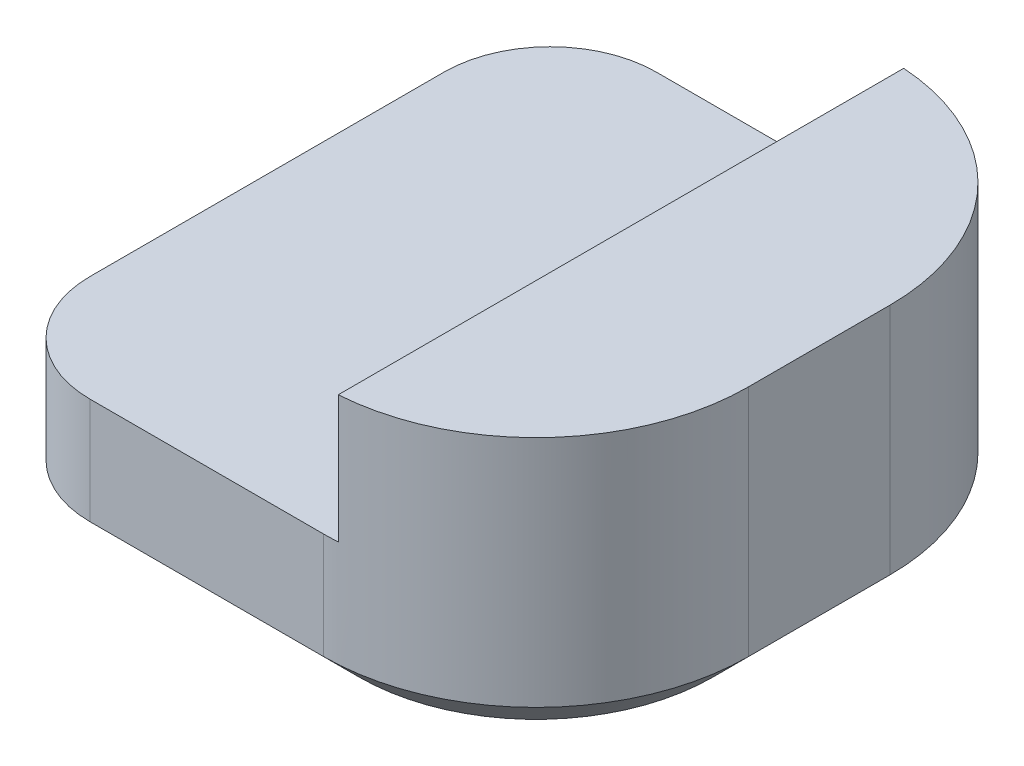
ISO-10303-21;
HEADER;
FILE_DESCRIPTION(('STEP AP214'),'2;1');
FILE_NAME('part.step','',(''),(''),'','','');
FILE_SCHEMA(('AUTOMOTIVE_DESIGN { 1 0 10303 214 1 1 1 1 }'));
ENDSEC;
DATA;
#1=APPLICATION_CONTEXT('core data for automotive mechanical design processes');
#2=APPLICATION_PROTOCOL_DEFINITION('international standard','automotive_design',2000,#1);
#3=PRODUCT_CONTEXT('',#1,'mechanical');
#4=PRODUCT('Part','Part','',(#3));
#5=PRODUCT_RELATED_PRODUCT_CATEGORY('part','',(#4));
#6=PRODUCT_DEFINITION_FORMATION('','',#4);
#7=PRODUCT_DEFINITION_CONTEXT('part definition',#1,'design');
#8=PRODUCT_DEFINITION('design','',#6,#7);
#9=PRODUCT_DEFINITION_SHAPE('','',#8);
#10=(LENGTH_UNIT() NAMED_UNIT(*) SI_UNIT(.MILLI.,.METRE.));
#11=(NAMED_UNIT(*) PLANE_ANGLE_UNIT() SI_UNIT($,.RADIAN.));
#12=(NAMED_UNIT(*) SI_UNIT($,.STERADIAN.) SOLID_ANGLE_UNIT());
#13=UNCERTAINTY_MEASURE_WITH_UNIT(LENGTH_MEASURE(1.E-05),#10,'distance_accuracy_value','');
#14=(GEOMETRIC_REPRESENTATION_CONTEXT(3) GLOBAL_UNCERTAINTY_ASSIGNED_CONTEXT((#13)) GLOBAL_UNIT_ASSIGNED_CONTEXT((#10,
#11,#12)) REPRESENTATION_CONTEXT('',''));
#15=CARTESIAN_POINT('',(0.,0.,0.));
#16=DIRECTION('',(0.,0.,1.));
#17=DIRECTION('',(1.,0.,0.));
#18=AXIS2_PLACEMENT_3D('',#15,#16,#17);
#19=CARTESIAN_POINT('',(0.,-2.,8.));
#20=DIRECTION('',(1.,0.,0.));
#21=DIRECTION('',(0.,0.,-1.));
#22=AXIS2_PLACEMENT_3D('',#19,#20,#21);
#23=PLANE('',#22);
#24=DIRECTION('',(0.,-1.,0.));
#25=VECTOR('',#24,1.);
#26=CARTESIAN_POINT('',(0.,-2.,1.5));
#27=LINE('',#26,#25);
#28=CARTESIAN_POINT('',(0.,0.,1.5));
#29=VERTEX_POINT('',#28);
#30=CARTESIAN_POINT('',(0.,-1.5,1.5));
#31=VERTEX_POINT('',#30);
#32=EDGE_CURVE('E200',#29,#31,#27,.T.);
#33=ORIENTED_EDGE('',*,*,#32,.T.);
#34=DIRECTION('',(0.,0.,1.));
#35=VECTOR('',#34,1.);
#36=CARTESIAN_POINT('',(0.,-1.5,8.));
#37=LINE('',#36,#35);
#38=CARTESIAN_POINT('',(0.,-1.5,6.5));
#39=VERTEX_POINT('',#38);
#40=EDGE_CURVE('E251',#31,#39,#37,.T.);
#41=ORIENTED_EDGE('',*,*,#40,.T.);
#42=DIRECTION('',(0.,-1.,0.));
#43=VECTOR('',#42,1.);
#44=CARTESIAN_POINT('',(0.,-2.,6.5));
#45=LINE('',#44,#43);
#46=CARTESIAN_POINT('',(0.,0.,6.5));
#47=VERTEX_POINT('',#46);
#48=EDGE_CURVE('E197',#39,#47,#45,.F.);
#49=ORIENTED_EDGE('',*,*,#48,.T.);
#50=DIRECTION('',(0.,0.,-1.));
#51=VECTOR('',#50,1.);
#52=CARTESIAN_POINT('',(0.,0.,8.));
#53=LINE('',#52,#51);
#54=EDGE_CURVE('E305',#47,#29,#53,.T.);
#55=ORIENTED_EDGE('',*,*,#54,.T.);
#56=EDGE_LOOP('',(#33,#41,#49,#55));
#57=FACE_BOUND('',#56,.T.);
#58=ADVANCED_FACE('F41',(#57),#23,.F.);
#59=CARTESIAN_POINT('',(6.43037974683545,-2.,8.));
#60=DIRECTION('',(0.,1.,0.));
#61=DIRECTION('',(-1.,0.,0.));
#62=AXIS2_PLACEMENT_3D('',#59,#60,#61);
#63=PLANE('',#62);
#64=CARTESIAN_POINT('',(4.8,-2.,5.));
#65=DIRECTION('',(0.,1.,0.));
#66=DIRECTION('',(-1.,0.,0.));
#67=AXIS2_PLACEMENT_3D('',#64,#65,#66);
#68=CIRCLE('',#67,2.5);
#69=CARTESIAN_POINT('',(7.3,-2.,5.));
#70=VERTEX_POINT('',#69);
#71=CARTESIAN_POINT('',(4.8,-2.,7.5));
#72=VERTEX_POINT('',#71);
#73=EDGE_CURVE('E236',#70,#72,#68,.F.);
#74=ORIENTED_EDGE('',*,*,#73,.T.);
#75=DIRECTION('',(-1.,0.,0.));
#76=VECTOR('',#75,1.);
#77=CARTESIAN_POINT('',(6.43037974683545,-2.,7.5));
#78=LINE('',#77,#76);
#79=CARTESIAN_POINT('',(1.5,-2.,7.5));
#80=VERTEX_POINT('',#79);
#81=EDGE_CURVE('E242',#72,#80,#78,.T.);
#82=ORIENTED_EDGE('',*,*,#81,.T.);
#83=CARTESIAN_POINT('',(1.5,-2.,6.5));
#84=DIRECTION('',(0.,1.,0.));
#85=DIRECTION('',(-1.,0.,0.));
#86=AXIS2_PLACEMENT_3D('',#83,#84,#85);
#87=CIRCLE('',#86,1.);
#88=CARTESIAN_POINT('',(0.499999999999999,-2.,6.5));
#89=VERTEX_POINT('',#88);
#90=EDGE_CURVE('E239',#80,#89,#87,.F.);
#91=ORIENTED_EDGE('',*,*,#90,.T.);
#92=DIRECTION('',(0.,0.,-1.));
#93=VECTOR('',#92,1.);
#94=CARTESIAN_POINT('',(0.499999999999999,-2.,8.));
#95=LINE('',#94,#93);
#96=CARTESIAN_POINT('',(0.499999999999999,-2.,1.5));
#97=VERTEX_POINT('',#96);
#98=EDGE_CURVE('E233',#89,#97,#95,.T.);
#99=ORIENTED_EDGE('',*,*,#98,.T.);
#100=CARTESIAN_POINT('',(1.5,-2.,1.5));
#101=DIRECTION('',(0.,1.,0.));
#102=DIRECTION('',(-1.,0.,0.));
#103=AXIS2_PLACEMENT_3D('',#100,#101,#102);
#104=CIRCLE('',#103,1.);
#105=CARTESIAN_POINT('',(1.5,-2.,0.499999999999999));
#106=VERTEX_POINT('',#105);
#107=EDGE_CURVE('E227',#97,#106,#104,.F.);
#108=ORIENTED_EDGE('',*,*,#107,.T.);
#109=DIRECTION('',(1.,0.,0.));
#110=VECTOR('',#109,1.);
#111=CARTESIAN_POINT('',(4.8,-2.,0.499999999999999));
#112=LINE('',#111,#110);
#113=CARTESIAN_POINT('',(4.8,-2.,0.499999999999999));
#114=VERTEX_POINT('',#113);
#115=EDGE_CURVE('E221',#106,#114,#112,.T.);
#116=ORIENTED_EDGE('',*,*,#115,.T.);
#117=CARTESIAN_POINT('',(4.8,-2.,3.));
#118=DIRECTION('',(0.,1.,0.));
#119=DIRECTION('',(-1.,0.,0.));
#120=AXIS2_PLACEMENT_3D('',#117,#118,#119);
#121=CIRCLE('',#120,2.5);
#122=CARTESIAN_POINT('',(7.3,-2.,3.));
#123=VERTEX_POINT('',#122);
#124=EDGE_CURVE('E224',#114,#123,#121,.F.);
#125=ORIENTED_EDGE('',*,*,#124,.T.);
#126=DIRECTION('',(0.,0.,1.));
#127=VECTOR('',#126,1.);
#128=CARTESIAN_POINT('',(7.3,-2.,8.));
#129=LINE('',#128,#127);
#130=EDGE_CURVE('E230',#123,#70,#129,.T.);
#131=ORIENTED_EDGE('',*,*,#130,.T.);
#132=EDGE_LOOP('',(#74,#82,#91,#99,#108,#116,#125,#131));
#133=FACE_BOUND('',#132,.T.);
#134=ADVANCED_FACE('F364',(#133),#63,.F.);
#135=CARTESIAN_POINT('',(7.8,1.8,8.));
#136=DIRECTION('',(-1.,0.,0.));
#137=DIRECTION('',(0.,0.,1.));
#138=AXIS2_PLACEMENT_3D('',#135,#136,#137);
#139=PLANE('',#138);
#140=DIRECTION('',(0.,1.,0.));
#141=VECTOR('',#140,1.);
#142=CARTESIAN_POINT('',(7.8,1.8,5.));
#143=LINE('',#142,#141);
#144=CARTESIAN_POINT('',(7.8,1.8,5.));
#145=VERTEX_POINT('',#144);
#146=CARTESIAN_POINT('',(7.8,-1.5,5.));
#147=VERTEX_POINT('',#146);
#148=EDGE_CURVE('E162',#145,#147,#143,.F.);
#149=ORIENTED_EDGE('',*,*,#148,.T.);
#150=DIRECTION('',(0.,0.,-1.));
#151=VECTOR('',#150,1.);
#152=CARTESIAN_POINT('',(7.8,-1.5,8.));
#153=LINE('',#152,#151);
#154=CARTESIAN_POINT('',(7.8,-1.5,3.));
#155=VERTEX_POINT('',#154);
#156=EDGE_CURVE('E254',#147,#155,#153,.T.);
#157=ORIENTED_EDGE('',*,*,#156,.T.);
#158=DIRECTION('',(0.,1.,0.));
#159=VECTOR('',#158,1.);
#160=CARTESIAN_POINT('',(7.8,1.8,3.));
#161=LINE('',#160,#159);
#162=CARTESIAN_POINT('',(7.8,1.8,3.));
#163=VERTEX_POINT('',#162);
#164=EDGE_CURVE('E157',#155,#163,#161,.T.);
#165=ORIENTED_EDGE('',*,*,#164,.T.);
#166=DIRECTION('',(0.,0.,-1.));
#167=VECTOR('',#166,1.);
#168=CARTESIAN_POINT('',(7.8,1.8,8.));
#169=LINE('',#168,#167);
#170=EDGE_CURVE('E149',#145,#163,#169,.T.);
#171=ORIENTED_EDGE('',*,*,#170,.F.);
#172=EDGE_LOOP('',(#149,#157,#165,#171));
#173=FACE_BOUND('',#172,.T.);
#174=ADVANCED_FACE('F161',(#173),#139,.F.);
#175=CARTESIAN_POINT('',(5.,1.8,8.));
#176=DIRECTION('',(0.,-1.,0.));
#177=DIRECTION('',(0.,0.,-1.));
#178=AXIS2_PLACEMENT_3D('',#175,#176,#177);
#179=PLANE('',#178);
#180=ORIENTED_EDGE('',*,*,#170,.T.);
#181=CARTESIAN_POINT('',(4.8,1.8,3.));
#182=DIRECTION('',(0.,-1.,0.));
#183=DIRECTION('',(0.,0.,-1.));
#184=AXIS2_PLACEMENT_3D('',#181,#182,#183);
#185=CIRCLE('',#184,3.);
#186=CARTESIAN_POINT('',(5.,1.8,0.00667409058084656));
#187=VERTEX_POINT('',#186);
#188=EDGE_CURVE('E156',#163,#187,#185,.F.);
#189=ORIENTED_EDGE('',*,*,#188,.T.);
#190=DIRECTION('',(0.,0.,-1.));
#191=VECTOR('',#190,1.);
#192=CARTESIAN_POINT('',(5.,1.8,8.));
#193=LINE('',#192,#191);
#194=CARTESIAN_POINT('',(5.,1.8,7.99332590941915));
#195=VERTEX_POINT('',#194);
#196=EDGE_CURVE('E151',#195,#187,#193,.T.);
#197=ORIENTED_EDGE('',*,*,#196,.F.);
#198=CARTESIAN_POINT('',(4.8,1.8,5.));
#199=DIRECTION('',(0.,-1.,0.));
#200=DIRECTION('',(0.,0.,-1.));
#201=AXIS2_PLACEMENT_3D('',#198,#199,#200);
#202=CIRCLE('',#201,3.);
#203=EDGE_CURVE('E146',#195,#145,#202,.F.);
#204=ORIENTED_EDGE('',*,*,#203,.T.);
#205=EDGE_LOOP('',(#180,#189,#197,#204));
#206=FACE_BOUND('',#205,.T.);
#207=ADVANCED_FACE('F148',(#206),#179,.F.);
#208=CARTESIAN_POINT('',(5.,0.,8.));
#209=DIRECTION('',(1.,0.,0.));
#210=DIRECTION('',(0.,0.,-1.));
#211=AXIS2_PLACEMENT_3D('',#208,#209,#210);
#212=PLANE('',#211);
#213=ORIENTED_EDGE('',*,*,#196,.T.);
#214=DIRECTION('',(0.,-1.,0.));
#215=VECTOR('',#214,1.);
#216=CARTESIAN_POINT('',(5.,1.8,0.00667409058084699));
#217=LINE('',#216,#215);
#218=CARTESIAN_POINT('',(5.,0.,0.00667409058084699));
#219=VERTEX_POINT('',#218);
#220=EDGE_CURVE('E182',#187,#219,#217,.T.);
#221=ORIENTED_EDGE('',*,*,#220,.T.);
#222=DIRECTION('',(0.,0.,-1.));
#223=VECTOR('',#222,1.);
#224=CARTESIAN_POINT('',(5.,0.,8.));
#225=LINE('',#224,#223);
#226=CARTESIAN_POINT('',(5.,0.,7.99332590941915));
#227=VERTEX_POINT('',#226);
#228=EDGE_CURVE('E311',#227,#219,#225,.T.);
#229=ORIENTED_EDGE('',*,*,#228,.F.);
#230=DIRECTION('',(0.,1.,0.));
#231=VECTOR('',#230,1.);
#232=CARTESIAN_POINT('',(5.,0.,7.99332590941915));
#233=LINE('',#232,#231);
#234=EDGE_CURVE('E179',#227,#195,#233,.T.);
#235=ORIENTED_EDGE('',*,*,#234,.T.);
#236=EDGE_LOOP('',(#213,#221,#229,#235));
#237=FACE_BOUND('',#236,.T.);
#238=ADVANCED_FACE('F317',(#237),#212,.F.);
#239=CARTESIAN_POINT('',(0.,0.,8.));
#240=DIRECTION('',(0.,-1.,0.));
#241=DIRECTION('',(0.,0.,-1.));
#242=AXIS2_PLACEMENT_3D('',#239,#240,#241);
#243=PLANE('',#242);
#244=DIRECTION('',(-1.,0.,0.));
#245=VECTOR('',#244,1.);
#246=CARTESIAN_POINT('',(0.,0.,0.));
#247=LINE('',#246,#245);
#248=CARTESIAN_POINT('',(4.8,0.,0.));
#249=VERTEX_POINT('',#248);
#250=CARTESIAN_POINT('',(1.5,0.,0.));
#251=VERTEX_POINT('',#250);
#252=EDGE_CURVE('E291',#249,#251,#247,.T.);
#253=ORIENTED_EDGE('',*,*,#252,.T.);
#254=CARTESIAN_POINT('',(1.5,0.,1.5));
#255=DIRECTION('',(0.,-1.,0.));
#256=DIRECTION('',(0.,0.,-1.));
#257=AXIS2_PLACEMENT_3D('',#254,#255,#256);
#258=CIRCLE('',#257,1.5);
#259=EDGE_CURVE('E210',#251,#29,#258,.F.);
#260=ORIENTED_EDGE('',*,*,#259,.T.);
#261=ORIENTED_EDGE('',*,*,#54,.F.);
#262=CARTESIAN_POINT('',(1.5,0.,6.5));
#263=DIRECTION('',(0.,-1.,0.));
#264=DIRECTION('',(0.,0.,-1.));
#265=AXIS2_PLACEMENT_3D('',#262,#263,#264);
#266=CIRCLE('',#265,1.5);
#267=CARTESIAN_POINT('',(1.5,0.,8.));
#268=VERTEX_POINT('',#267);
#269=EDGE_CURVE('E207',#47,#268,#266,.F.);
#270=ORIENTED_EDGE('',*,*,#269,.T.);
#271=DIRECTION('',(-1.,0.,0.));
#272=VECTOR('',#271,1.);
#273=CARTESIAN_POINT('',(0.,0.,8.));
#274=LINE('',#273,#272);
#275=CARTESIAN_POINT('',(4.8,0.,8.));
#276=VERTEX_POINT('',#275);
#277=EDGE_CURVE('E298',#276,#268,#274,.T.);
#278=ORIENTED_EDGE('',*,*,#277,.F.);
#279=CARTESIAN_POINT('',(4.8,0.,5.));
#280=DIRECTION('',(0.,-1.,0.));
#281=DIRECTION('',(0.,0.,-1.));
#282=AXIS2_PLACEMENT_3D('',#279,#280,#281);
#283=CIRCLE('',#282,3.);
#284=EDGE_CURVE('E185',#276,#227,#283,.F.);
#285=ORIENTED_EDGE('',*,*,#284,.T.);
#286=ORIENTED_EDGE('',*,*,#228,.T.);
#287=CARTESIAN_POINT('',(4.8,0.,3.));
#288=DIRECTION('',(0.,-1.,0.));
#289=DIRECTION('',(0.,0.,-1.));
#290=AXIS2_PLACEMENT_3D('',#287,#288,#289);
#291=CIRCLE('',#290,3.);
#292=EDGE_CURVE('E188',#219,#249,#291,.F.);
#293=ORIENTED_EDGE('',*,*,#292,.T.);
#294=EDGE_LOOP('',(#253,#260,#261,#270,#278,#285,#286,#293));
#295=FACE_BOUND('',#294,.T.);
#296=ADVANCED_FACE('F321',(#295),#243,.F.);
#297=CARTESIAN_POINT('',(0.,0.,8.));
#298=DIRECTION('',(0.,0.,-1.));
#299=DIRECTION('',(-1.,0.,0.));
#300=AXIS2_PLACEMENT_3D('',#297,#298,#299);
#301=PLANE('',#300);
#302=DIRECTION('',(0.,-1.,0.));
#303=VECTOR('',#302,1.);
#304=CARTESIAN_POINT('',(1.5,0.,8.));
#305=LINE('',#304,#303);
#306=CARTESIAN_POINT('',(1.5,-1.5,8.));
#307=VERTEX_POINT('',#306);
#308=EDGE_CURVE('E213',#268,#307,#305,.T.);
#309=ORIENTED_EDGE('',*,*,#308,.T.);
#310=DIRECTION('',(1.,0.,0.));
#311=VECTOR('',#310,1.);
#312=CARTESIAN_POINT('',(0.,-1.5,8.));
#313=LINE('',#312,#311);
#314=CARTESIAN_POINT('',(4.8,-1.5,8.));
#315=VERTEX_POINT('',#314);
#316=EDGE_CURVE('E217',#307,#315,#313,.T.);
#317=ORIENTED_EDGE('',*,*,#316,.T.);
#318=DIRECTION('',(0.,1.,0.));
#319=VECTOR('',#318,1.);
#320=CARTESIAN_POINT('',(4.8,0.,8.));
#321=LINE('',#320,#319);
#322=EDGE_CURVE('E194',#315,#276,#321,.T.);
#323=ORIENTED_EDGE('',*,*,#322,.T.);
#324=ORIENTED_EDGE('',*,*,#277,.T.);
#325=EDGE_LOOP('',(#309,#317,#323,#324));
#326=FACE_BOUND('',#325,.T.);
#327=ADVANCED_FACE('F345',(#326),#301,.F.);
#328=CARTESIAN_POINT('',(0.,0.,0.));
#329=DIRECTION('',(0.,0.,-1.));
#330=DIRECTION('',(-1.,0.,0.));
#331=AXIS2_PLACEMENT_3D('',#328,#329,#330);
#332=PLANE('',#331);
#333=DIRECTION('',(0.,1.,0.));
#334=VECTOR('',#333,1.);
#335=CARTESIAN_POINT('',(4.8,-2.,0.));
#336=LINE('',#335,#334);
#337=CARTESIAN_POINT('',(4.8,-1.5,0.));
#338=VERTEX_POINT('',#337);
#339=EDGE_CURVE('E191',#249,#338,#336,.F.);
#340=ORIENTED_EDGE('',*,*,#339,.T.);
#341=DIRECTION('',(-1.,0.,0.));
#342=VECTOR('',#341,1.);
#343=CARTESIAN_POINT('',(1.5,-1.5,0.));
#344=LINE('',#343,#342);
#345=CARTESIAN_POINT('',(1.5,-1.5,0.));
#346=VERTEX_POINT('',#345);
#347=EDGE_CURVE('E11',#338,#346,#344,.T.);
#348=ORIENTED_EDGE('',*,*,#347,.T.);
#349=DIRECTION('',(0.,-1.,0.));
#350=VECTOR('',#349,1.);
#351=CARTESIAN_POINT('',(1.5,0.,0.));
#352=LINE('',#351,#350);
#353=EDGE_CURVE('E204',#346,#251,#352,.F.);
#354=ORIENTED_EDGE('',*,*,#353,.T.);
#355=ORIENTED_EDGE('',*,*,#252,.F.);
#356=EDGE_LOOP('',(#340,#348,#354,#355));
#357=FACE_BOUND('',#356,.T.);
#358=ADVANCED_FACE('F322',(#357),#332,.T.);
#359=CARTESIAN_POINT('',(4.8,1.8,3.));
#360=DIRECTION('',(0.,-1.,0.));
#361=DIRECTION('',(0.,0.,-1.));
#362=AXIS2_PLACEMENT_3D('',#359,#360,#361);
#363=CYLINDRICAL_SURFACE('',#362,3.);
#364=ORIENTED_EDGE('',*,*,#164,.F.);
#365=CARTESIAN_POINT('',(4.8,-1.5,3.));
#366=DIRECTION('',(0.,1.,0.));
#367=DIRECTION('',(0.,0.,1.));
#368=AXIS2_PLACEMENT_3D('',#365,#366,#367);
#369=CIRCLE('',#368,3.);
#370=EDGE_CURVE('E52',#155,#338,#369,.T.);
#371=ORIENTED_EDGE('',*,*,#370,.T.);
#372=ORIENTED_EDGE('',*,*,#339,.F.);
#373=ORIENTED_EDGE('',*,*,#292,.F.);
#374=ORIENTED_EDGE('',*,*,#220,.F.);
#375=ORIENTED_EDGE('',*,*,#188,.F.);
#376=EDGE_LOOP('',(#364,#371,#372,#373,#374,#375));
#377=FACE_BOUND('',#376,.T.);
#378=ADVANCED_FACE('F320',(#377),#363,.T.);
#379=CARTESIAN_POINT('',(4.8,0.,5.));
#380=DIRECTION('',(0.,1.,0.));
#381=DIRECTION('',(0.,0.,1.));
#382=AXIS2_PLACEMENT_3D('',#379,#380,#381);
#383=CYLINDRICAL_SURFACE('',#382,3.);
#384=ORIENTED_EDGE('',*,*,#322,.F.);
#385=CARTESIAN_POINT('',(4.8,-1.5,5.));
#386=DIRECTION('',(0.,1.,0.));
#387=DIRECTION('',(0.,0.,1.));
#388=AXIS2_PLACEMENT_3D('',#385,#386,#387);
#389=CIRCLE('',#388,3.);
#390=EDGE_CURVE('E170',#315,#147,#389,.T.);
#391=ORIENTED_EDGE('',*,*,#390,.T.);
#392=ORIENTED_EDGE('',*,*,#148,.F.);
#393=ORIENTED_EDGE('',*,*,#203,.F.);
#394=ORIENTED_EDGE('',*,*,#234,.F.);
#395=ORIENTED_EDGE('',*,*,#284,.F.);
#396=EDGE_LOOP('',(#384,#391,#392,#393,#394,#395));
#397=FACE_BOUND('',#396,.T.);
#398=ADVANCED_FACE('F168',(#397),#383,.T.);
#399=CARTESIAN_POINT('',(1.5,-2.,1.5));
#400=DIRECTION('',(0.,1.,0.));
#401=DIRECTION('',(0.,0.,1.));
#402=AXIS2_PLACEMENT_3D('',#399,#400,#401);
#403=CYLINDRICAL_SURFACE('',#402,1.5);
#404=ORIENTED_EDGE('',*,*,#353,.F.);
#405=CARTESIAN_POINT('',(1.5,-1.5,1.5));
#406=DIRECTION('',(0.,1.,0.));
#407=DIRECTION('',(0.,0.,1.));
#408=AXIS2_PLACEMENT_3D('',#405,#406,#407);
#409=CIRCLE('',#408,1.5);
#410=EDGE_CURVE('E257',#346,#31,#409,.T.);
#411=ORIENTED_EDGE('',*,*,#410,.T.);
#412=ORIENTED_EDGE('',*,*,#32,.F.);
#413=ORIENTED_EDGE('',*,*,#259,.F.);
#414=EDGE_LOOP('',(#404,#411,#412,#413));
#415=FACE_BOUND('',#414,.T.);
#416=ADVANCED_FACE('F324',(#415),#403,.T.);
#417=CARTESIAN_POINT('',(1.5,0.,6.5));
#418=DIRECTION('',(0.,-1.,0.));
#419=DIRECTION('',(0.,0.,-1.));
#420=AXIS2_PLACEMENT_3D('',#417,#418,#419);
#421=CYLINDRICAL_SURFACE('',#420,1.5);
#422=ORIENTED_EDGE('',*,*,#48,.F.);
#423=CARTESIAN_POINT('',(1.5,-1.5,6.5));
#424=DIRECTION('',(0.,1.,0.));
#425=DIRECTION('',(0.,0.,1.));
#426=AXIS2_PLACEMENT_3D('',#423,#424,#425);
#427=CIRCLE('',#426,1.5);
#428=EDGE_CURVE('E246',#39,#307,#427,.T.);
#429=ORIENTED_EDGE('',*,*,#428,.T.);
#430=ORIENTED_EDGE('',*,*,#308,.F.);
#431=ORIENTED_EDGE('',*,*,#269,.F.);
#432=EDGE_LOOP('',(#422,#429,#430,#431));
#433=FACE_BOUND('',#432,.T.);
#434=ADVANCED_FACE('F341',(#433),#421,.T.);
#435=CARTESIAN_POINT('',(6.43037974683545,-2.,0.499999999999999));
#436=DIRECTION('',(0.,-0.707106781186545,-0.70710678118655));
#437=DIRECTION('',(-1.,0.,0.));
#438=AXIS2_PLACEMENT_3D('',#435,#436,#437);
#439=PLANE('',#438);
#440=DIRECTION('',(0.,0.70710678118655,-0.707106781186545));
#441=VECTOR('',#440,1.);
#442=CARTESIAN_POINT('',(4.8,-2.,0.499999999999999));
#443=LINE('',#442,#441);
#444=EDGE_CURVE('E283',#114,#338,#443,.T.);
#445=ORIENTED_EDGE('',*,*,#444,.F.);
#446=ORIENTED_EDGE('',*,*,#115,.F.);
#447=DIRECTION('',(0.,-0.70710678118655,0.707106781186545));
#448=VECTOR('',#447,1.);
#449=CARTESIAN_POINT('',(1.5,-1.5,0.));
#450=LINE('',#449,#448);
#451=EDGE_CURVE('E46',#346,#106,#450,.T.);
#452=ORIENTED_EDGE('',*,*,#451,.F.);
#453=ORIENTED_EDGE('',*,*,#347,.F.);
#454=EDGE_LOOP('',(#445,#446,#452,#453));
#455=FACE_BOUND('',#454,.T.);
#456=ADVANCED_FACE('F44',(#455),#439,.T.);
#457=CARTESIAN_POINT('',(1.5,-2.,1.5));
#458=DIRECTION('',(0.,1.,0.));
#459=DIRECTION('',(0.,0.,1.));
#460=AXIS2_PLACEMENT_3D('',#457,#458,#459);
#461=CONICAL_SURFACE('',#460,1.,0.785398163397445);
#462=ORIENTED_EDGE('',*,*,#451,.T.);
#463=ORIENTED_EDGE('',*,*,#107,.F.);
#464=DIRECTION('',(0.707106781186544,-0.707106781186551,0.));
#465=VECTOR('',#464,1.);
#466=CARTESIAN_POINT('',(0.,-1.5,1.5));
#467=LINE('',#466,#465);
#468=EDGE_CURVE('E280',#31,#97,#467,.T.);
#469=ORIENTED_EDGE('',*,*,#468,.F.);
#470=ORIENTED_EDGE('',*,*,#410,.F.);
#471=EDGE_LOOP('',(#462,#463,#469,#470));
#472=FACE_BOUND('',#471,.T.);
#473=ADVANCED_FACE('F329',(#472),#461,.T.);
#474=CARTESIAN_POINT('',(4.8,-2.,3.));
#475=DIRECTION('',(0.,1.,0.));
#476=DIRECTION('',(0.,0.,1.));
#477=AXIS2_PLACEMENT_3D('',#474,#475,#476);
#478=CONICAL_SURFACE('',#477,2.5,0.785398163397445);
#479=ORIENTED_EDGE('',*,*,#444,.T.);
#480=ORIENTED_EDGE('',*,*,#370,.F.);
#481=DIRECTION('',(0.707106781186545,0.70710678118655,0.));
#482=VECTOR('',#481,1.);
#483=CARTESIAN_POINT('',(7.3,-2.,3.));
#484=LINE('',#483,#482);
#485=EDGE_CURVE('E276',#123,#155,#484,.T.);
#486=ORIENTED_EDGE('',*,*,#485,.F.);
#487=ORIENTED_EDGE('',*,*,#124,.F.);
#488=EDGE_LOOP('',(#479,#480,#486,#487));
#489=FACE_BOUND('',#488,.T.);
#490=ADVANCED_FACE('F362',(#489),#478,.T.);
#491=CARTESIAN_POINT('',(0.499999999999999,-2.,8.));
#492=DIRECTION('',(0.70710678118655,0.707106781186545,0.));
#493=DIRECTION('',(0.,0.,-1.));
#494=AXIS2_PLACEMENT_3D('',#491,#492,#493);
#495=PLANE('',#494);
#496=ORIENTED_EDGE('',*,*,#468,.T.);
#497=ORIENTED_EDGE('',*,*,#98,.F.);
#498=DIRECTION('',(0.707106781186545,-0.70710678118655,0.));
#499=VECTOR('',#498,1.);
#500=CARTESIAN_POINT('',(0.,-1.5,6.5));
#501=LINE('',#500,#499);
#502=EDGE_CURVE('E272',#39,#89,#501,.T.);
#503=ORIENTED_EDGE('',*,*,#502,.F.);
#504=ORIENTED_EDGE('',*,*,#40,.F.);
#505=EDGE_LOOP('',(#496,#497,#503,#504));
#506=FACE_BOUND('',#505,.T.);
#507=ADVANCED_FACE('F334',(#506),#495,.F.);
#508=CARTESIAN_POINT('',(7.8,-1.5,8.));
#509=DIRECTION('',(-0.70710678118655,0.707106781186545,0.));
#510=DIRECTION('',(0.,0.,-1.));
#511=AXIS2_PLACEMENT_3D('',#508,#509,#510);
#512=PLANE('',#511);
#513=ORIENTED_EDGE('',*,*,#485,.T.);
#514=ORIENTED_EDGE('',*,*,#156,.F.);
#515=DIRECTION('',(0.707106781186545,0.70710678118655,0.));
#516=VECTOR('',#515,1.);
#517=CARTESIAN_POINT('',(7.3,-2.,5.));
#518=LINE('',#517,#516);
#519=EDGE_CURVE('E268',#70,#147,#518,.T.);
#520=ORIENTED_EDGE('',*,*,#519,.F.);
#521=ORIENTED_EDGE('',*,*,#130,.F.);
#522=EDGE_LOOP('',(#513,#514,#520,#521));
#523=FACE_BOUND('',#522,.T.);
#524=ADVANCED_FACE('F360',(#523),#512,.F.);
#525=CARTESIAN_POINT('',(1.5,-2.,6.5));
#526=DIRECTION('',(0.,1.,0.));
#527=DIRECTION('',(0.,0.,1.));
#528=AXIS2_PLACEMENT_3D('',#525,#526,#527);
#529=CONICAL_SURFACE('',#528,1.,0.785398163397445);
#530=ORIENTED_EDGE('',*,*,#502,.T.);
#531=ORIENTED_EDGE('',*,*,#90,.F.);
#532=DIRECTION('',(0.,-0.70710678118655,-0.707106781186545));
#533=VECTOR('',#532,1.);
#534=CARTESIAN_POINT('',(1.5,-1.5,8.));
#535=LINE('',#534,#533);
#536=EDGE_CURVE('E265',#307,#80,#535,.T.);
#537=ORIENTED_EDGE('',*,*,#536,.F.);
#538=ORIENTED_EDGE('',*,*,#428,.F.);
#539=EDGE_LOOP('',(#530,#531,#537,#538));
#540=FACE_BOUND('',#539,.T.);
#541=ADVANCED_FACE('F366',(#540),#529,.T.);
#542=CARTESIAN_POINT('',(4.8,-2.,5.));
#543=DIRECTION('',(0.,1.,0.));
#544=DIRECTION('',(0.,0.,1.));
#545=AXIS2_PLACEMENT_3D('',#542,#543,#544);
#546=CONICAL_SURFACE('',#545,2.5,0.785398163397445);
#547=ORIENTED_EDGE('',*,*,#519,.T.);
#548=ORIENTED_EDGE('',*,*,#390,.F.);
#549=DIRECTION('',(0.,0.70710678118655,0.707106781186545));
#550=VECTOR('',#549,1.);
#551=CARTESIAN_POINT('',(4.8,-2.,7.5));
#552=LINE('',#551,#550);
#553=EDGE_CURVE('E262',#72,#315,#552,.T.);
#554=ORIENTED_EDGE('',*,*,#553,.F.);
#555=ORIENTED_EDGE('',*,*,#73,.F.);
#556=EDGE_LOOP('',(#547,#548,#554,#555));
#557=FACE_BOUND('',#556,.T.);
#558=ADVANCED_FACE('F356',(#557),#546,.T.);
#559=CARTESIAN_POINT('',(0.,-1.5,8.));
#560=DIRECTION('',(0.,0.707106781186545,-0.70710678118655));
#561=DIRECTION('',(1.,0.,0.));
#562=AXIS2_PLACEMENT_3D('',#559,#560,#561);
#563=PLANE('',#562);
#564=ORIENTED_EDGE('',*,*,#536,.T.);
#565=ORIENTED_EDGE('',*,*,#81,.F.);
#566=ORIENTED_EDGE('',*,*,#553,.T.);
#567=ORIENTED_EDGE('',*,*,#316,.F.);
#568=EDGE_LOOP('',(#564,#565,#566,#567));
#569=FACE_BOUND('',#568,.T.);
#570=ADVANCED_FACE('F350',(#569),#563,.F.);
#571=CLOSED_SHELL('',(#58,#134,#174,#207,#238,#296,#327,#358,#378,#398,#416,#434,#456,#473,#490,
#507,#524,#541,#558,#570));
#572=MANIFOLD_SOLID_BREP('B2',#571);
#573=ADVANCED_BREP_SHAPE_REPRESENTATION('',(#18,#572),#14);
#574=SHAPE_DEFINITION_REPRESENTATION(#9,#573);
ENDSEC;
END-ISO-10303-21;
